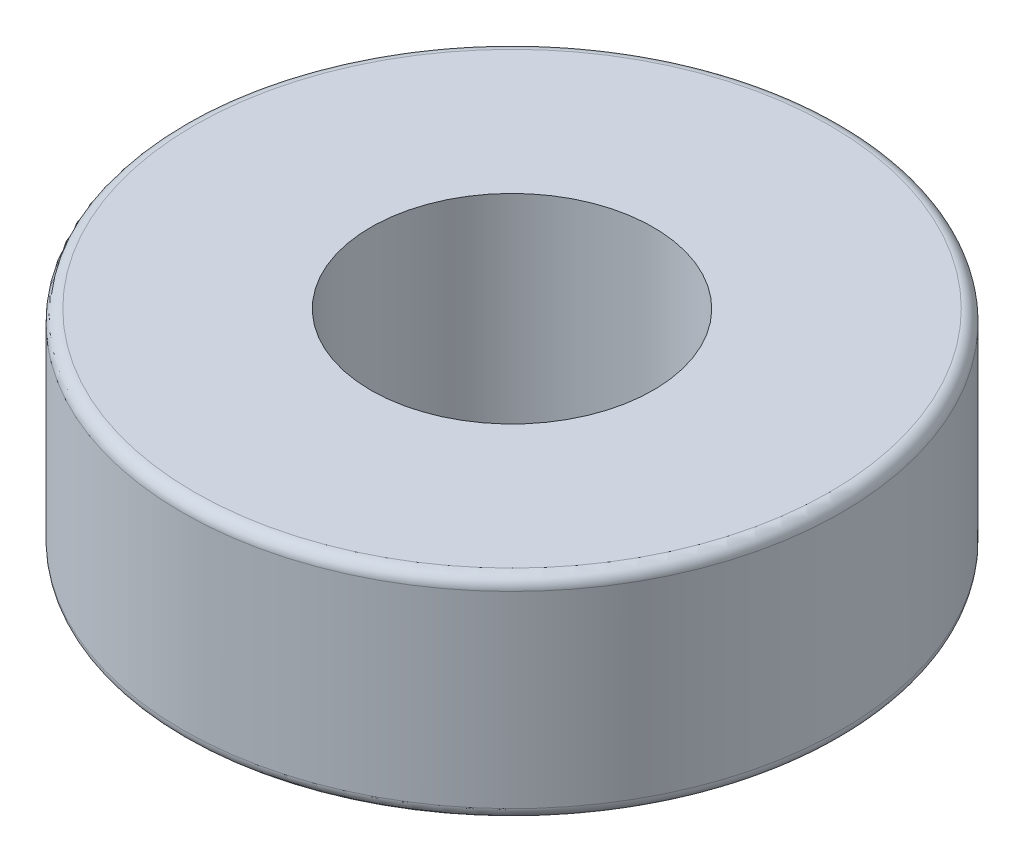
ISO-10303-21;
HEADER;
FILE_DESCRIPTION(('STEP AP214'),'2;1');
FILE_NAME('part.step','',(''),(''),'','','');
FILE_SCHEMA(('AUTOMOTIVE_DESIGN { 1 0 10303 214 1 1 1 1 }'));
ENDSEC;
DATA;
#1=APPLICATION_CONTEXT('core data for automotive mechanical design processes');
#2=APPLICATION_PROTOCOL_DEFINITION('international standard','automotive_design',2000,#1);
#3=PRODUCT_CONTEXT('',#1,'mechanical');
#4=PRODUCT('Part','Part','',(#3));
#5=PRODUCT_RELATED_PRODUCT_CATEGORY('part','',(#4));
#6=PRODUCT_DEFINITION_FORMATION('','',#4);
#7=PRODUCT_DEFINITION_CONTEXT('part definition',#1,'design');
#8=PRODUCT_DEFINITION('design','',#6,#7);
#9=PRODUCT_DEFINITION_SHAPE('','',#8);
#10=(LENGTH_UNIT() NAMED_UNIT(*) SI_UNIT(.MILLI.,.METRE.));
#11=(NAMED_UNIT(*) PLANE_ANGLE_UNIT() SI_UNIT($,.RADIAN.));
#12=(NAMED_UNIT(*) SI_UNIT($,.STERADIAN.) SOLID_ANGLE_UNIT());
#13=UNCERTAINTY_MEASURE_WITH_UNIT(LENGTH_MEASURE(1.E-05),#10,'distance_accuracy_value','');
#14=(GEOMETRIC_REPRESENTATION_CONTEXT(3) GLOBAL_UNCERTAINTY_ASSIGNED_CONTEXT((#13)) GLOBAL_UNIT_ASSIGNED_CONTEXT((#10,
#11,#12)) REPRESENTATION_CONTEXT('',''));
#15=CARTESIAN_POINT('',(0.,0.,0.));
#16=DIRECTION('',(0.,0.,1.));
#17=DIRECTION('',(1.,0.,0.));
#18=AXIS2_PLACEMENT_3D('',#15,#16,#17);
#19=CARTESIAN_POINT('',(0.,-3.571,4.7625));
#20=DIRECTION('',(0.,-1.,0.));
#21=DIRECTION('',(0.,0.,-1.));
#22=AXIS2_PLACEMENT_3D('',#19,#20,#21);
#23=PLANE('',#22);
#24=CARTESIAN_POINT('',(0.,-3.571,0.));
#25=DIRECTION('',(0.,-1.,0.));
#26=DIRECTION('',(0.,0.,-1.));
#27=AXIS2_PLACEMENT_3D('',#24,#25,#26);
#28=CIRCLE('',#27,10.7125);
#29=CARTESIAN_POINT('',(0.,-3.571,-10.7125));
#30=VERTEX_POINT('',#29);
#31=EDGE_CURVE('E10',#30,#30,#28,.T.);
#32=ORIENTED_EDGE('',*,*,#31,.T.);
#33=EDGE_LOOP('',(#32));
#34=FACE_BOUND('',#33,.T.);
#35=CARTESIAN_POINT('',(0.,-3.571,0.));
#36=DIRECTION('',(0.,1.,0.));
#37=DIRECTION('',(0.,0.,1.));
#38=AXIS2_PLACEMENT_3D('',#35,#36,#37);
#39=CIRCLE('',#38,4.7625);
#40=CARTESIAN_POINT('',(0.,-3.571,4.7625));
#41=VERTEX_POINT('',#40);
#42=EDGE_CURVE('E61',#41,#41,#39,.T.);
#43=ORIENTED_EDGE('',*,*,#42,.T.);
#44=EDGE_LOOP('',(#43));
#45=FACE_BOUND('',#44,.T.);
#46=ADVANCED_FACE('F37',(#34,#45),#23,.T.);
#47=CARTESIAN_POINT('',(0.,0.,0.));
#48=DIRECTION('',(0.,1.,0.));
#49=DIRECTION('',(0.,0.,1.));
#50=AXIS2_PLACEMENT_3D('',#47,#48,#49);
#51=CYLINDRICAL_SURFACE('',#50,4.7625);
#52=CARTESIAN_POINT('',(0.,3.571,0.));
#53=DIRECTION('',(0.,1.,0.));
#54=DIRECTION('',(0.,0.,1.));
#55=AXIS2_PLACEMENT_3D('',#52,#53,#54);
#56=CIRCLE('',#55,4.7625);
#57=CARTESIAN_POINT('',(0.,3.571,4.7625));
#58=VERTEX_POINT('',#57);
#59=EDGE_CURVE('E65',#58,#58,#56,.T.);
#60=ORIENTED_EDGE('',*,*,#59,.T.);
#61=EDGE_LOOP('',(#60));
#62=FACE_BOUND('',#61,.T.);
#63=ORIENTED_EDGE('',*,*,#42,.F.);
#64=EDGE_LOOP('',(#63));
#65=FACE_BOUND('',#64,.T.);
#66=ADVANCED_FACE('F70',(#62,#65),#51,.F.);
#67=CARTESIAN_POINT('',(0.,3.571,11.1125));
#68=DIRECTION('',(0.,1.,0.));
#69=DIRECTION('',(0.,0.,1.));
#70=AXIS2_PLACEMENT_3D('',#67,#68,#69);
#71=PLANE('',#70);
#72=CARTESIAN_POINT('',(0.,3.571,0.));
#73=DIRECTION('',(0.,1.,0.));
#74=DIRECTION('',(0.,0.,1.));
#75=AXIS2_PLACEMENT_3D('',#72,#73,#74);
#76=CIRCLE('',#75,10.7125);
#77=CARTESIAN_POINT('',(0.,3.571,10.7125));
#78=VERTEX_POINT('',#77);
#79=EDGE_CURVE('E55',#78,#78,#76,.T.);
#80=ORIENTED_EDGE('',*,*,#79,.T.);
#81=EDGE_LOOP('',(#80));
#82=FACE_BOUND('',#81,.T.);
#83=ORIENTED_EDGE('',*,*,#59,.F.);
#84=EDGE_LOOP('',(#83));
#85=FACE_BOUND('',#84,.T.);
#86=ADVANCED_FACE('F73',(#82,#85),#71,.T.);
#87=CARTESIAN_POINT('',(0.,0.,0.));
#88=DIRECTION('',(0.,1.,0.));
#89=DIRECTION('',(0.,0.,1.));
#90=AXIS2_PLACEMENT_3D('',#87,#88,#89);
#91=CYLINDRICAL_SURFACE('',#90,11.1125);
#92=CARTESIAN_POINT('',(0.,3.171,0.));
#93=DIRECTION('',(0.,1.,0.));
#94=DIRECTION('',(0.,0.,1.));
#95=AXIS2_PLACEMENT_3D('',#92,#93,#94);
#96=CIRCLE('',#95,11.1125);
#97=CARTESIAN_POINT('',(0.,3.171,11.1125));
#98=VERTEX_POINT('',#97);
#99=EDGE_CURVE('E45',#98,#98,#96,.F.);
#100=ORIENTED_EDGE('',*,*,#99,.T.);
#101=EDGE_LOOP('',(#100));
#102=FACE_BOUND('',#101,.T.);
#103=CARTESIAN_POINT('',(0.,-3.171,0.));
#104=DIRECTION('',(0.,-1.,0.));
#105=DIRECTION('',(0.,0.,-1.));
#106=AXIS2_PLACEMENT_3D('',#103,#104,#105);
#107=CIRCLE('',#106,11.1125);
#108=CARTESIAN_POINT('',(0.,-3.171,-11.1125));
#109=VERTEX_POINT('',#108);
#110=EDGE_CURVE('E50',#109,#109,#107,.F.);
#111=ORIENTED_EDGE('',*,*,#110,.T.);
#112=EDGE_LOOP('',(#111));
#113=FACE_BOUND('',#112,.T.);
#114=ADVANCED_FACE('F75',(#102,#113),#91,.T.);
#115=CARTESIAN_POINT('',(0.,3.171,0.));
#116=DIRECTION('',(0.,1.,0.));
#117=DIRECTION('',(0.,0.,1.));
#118=AXIS2_PLACEMENT_3D('',#115,#116,#117);
#119=TOROIDAL_SURFACE('',#118,10.7125,0.4);
#120=ORIENTED_EDGE('',*,*,#99,.F.);
#121=EDGE_LOOP('',(#120));
#122=FACE_BOUND('',#121,.T.);
#123=ORIENTED_EDGE('',*,*,#79,.F.);
#124=EDGE_LOOP('',(#123));
#125=FACE_BOUND('',#124,.T.);
#126=ADVANCED_FACE('F82',(#122,#125),#119,.T.);
#127=CARTESIAN_POINT('',(0.,-3.171,0.));
#128=DIRECTION('',(0.,-1.,0.));
#129=DIRECTION('',(0.,0.,-1.));
#130=AXIS2_PLACEMENT_3D('',#127,#128,#129);
#131=TOROIDAL_SURFACE('',#130,10.7125,0.4);
#132=ORIENTED_EDGE('',*,*,#31,.F.);
#133=EDGE_LOOP('',(#132));
#134=FACE_BOUND('',#133,.T.);
#135=ORIENTED_EDGE('',*,*,#110,.F.);
#136=EDGE_LOOP('',(#135));
#137=FACE_BOUND('',#136,.T.);
#138=ADVANCED_FACE('F39',(#134,#137),#131,.T.);
#139=CLOSED_SHELL('',(#46,#66,#86,#114,#126,#138));
#140=MANIFOLD_SOLID_BREP('B2',#139);
#141=ADVANCED_BREP_SHAPE_REPRESENTATION('',(#18,#140),#14);
#142=SHAPE_DEFINITION_REPRESENTATION(#9,#141);
ENDSEC;
END-ISO-10303-21;
